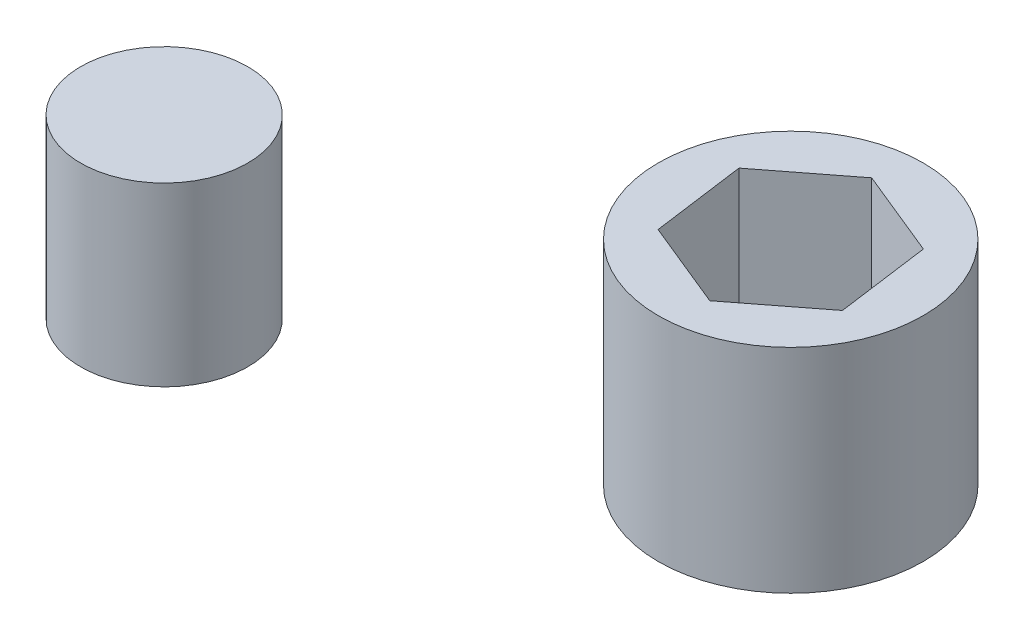
ISO-10303-21;
HEADER;
FILE_DESCRIPTION(('STEP AP214'),'2;1');
FILE_NAME('part.step','',(''),(''),'','','');
FILE_SCHEMA(('AUTOMOTIVE_DESIGN { 1 0 10303 214 1 1 1 1 }'));
ENDSEC;
DATA;
#1=APPLICATION_CONTEXT('core data for automotive mechanical design processes');
#2=APPLICATION_PROTOCOL_DEFINITION('international standard','automotive_design',2000,#1);
#3=PRODUCT_CONTEXT('',#1,'mechanical');
#4=PRODUCT('Part','Part','',(#3));
#5=PRODUCT_RELATED_PRODUCT_CATEGORY('part','',(#4));
#6=PRODUCT_DEFINITION_FORMATION('','',#4);
#7=PRODUCT_DEFINITION_CONTEXT('part definition',#1,'design');
#8=PRODUCT_DEFINITION('design','',#6,#7);
#9=PRODUCT_DEFINITION_SHAPE('','',#8);
#10=(LENGTH_UNIT() NAMED_UNIT(*) SI_UNIT(.MILLI.,.METRE.));
#11=(NAMED_UNIT(*) PLANE_ANGLE_UNIT() SI_UNIT($,.RADIAN.));
#12=(NAMED_UNIT(*) SI_UNIT($,.STERADIAN.) SOLID_ANGLE_UNIT());
#13=UNCERTAINTY_MEASURE_WITH_UNIT(LENGTH_MEASURE(1.E-05),#10,'distance_accuracy_value','');
#14=(GEOMETRIC_REPRESENTATION_CONTEXT(3) GLOBAL_UNCERTAINTY_ASSIGNED_CONTEXT((#13)) GLOBAL_UNIT_ASSIGNED_CONTEXT((#10,
#11,#12)) REPRESENTATION_CONTEXT('',''));
#15=CARTESIAN_POINT('',(0.,0.,0.));
#16=DIRECTION('',(0.,0.,1.));
#17=DIRECTION('',(1.,0.,0.));
#18=AXIS2_PLACEMENT_3D('',#15,#16,#17);
#19=CARTESIAN_POINT('',(172.422527698443,80.264,-63.7213689320332));
#20=DIRECTION('',(0.,1.,0.));
#21=DIRECTION('',(0.,0.,1.));
#22=AXIS2_PLACEMENT_3D('',#19,#20,#21);
#23=PLANE('',#22);
#24=CARTESIAN_POINT('',(172.422527698443,80.264,-63.7213689320332));
#25=DIRECTION('',(0.,1.,0.));
#26=DIRECTION('',(0.,0.,1.));
#27=AXIS2_PLACEMENT_3D('',#24,#25,#26);
#28=CIRCLE('',#27,49.907526651771);
#29=CARTESIAN_POINT('',(172.422527698443,80.264,-13.8138422802622));
#30=VERTEX_POINT('',#29);
#31=EDGE_CURVE('E12',#30,#30,#28,.T.);
#32=ORIENTED_EDGE('',*,*,#31,.T.);
#33=EDGE_LOOP('',(#32));
#34=FACE_BOUND('',#33,.T.);
#35=DIRECTION('',(-0.134867815001697,0.,-0.99086359932973));
#36=VECTOR('',#35,1.);
#37=CARTESIAN_POINT('',(205.40770691032,80.264,-50.2274319817206));
#38=LINE('',#37,#36);
#39=CARTESIAN_POINT('',(205.40770691032,80.264,-50.2274319817206));
#40=VERTEX_POINT('',#39);
#41=CARTESIAN_POINT('',(200.601209500418,80.264,-85.5404036027441));
#42=VERTEX_POINT('',#41);
#43=EDGE_CURVE('E107',#40,#42,#38,.T.);
#44=ORIENTED_EDGE('',*,*,#43,.F.);
#45=DIRECTION('',(0.790679141203983,0.,-0.612230753609235));
#46=VECTOR('',#45,1.);
#47=CARTESIAN_POINT('',(177.229025108345,80.264,-28.4083973110097));
#48=LINE('',#47,#46);
#49=CARTESIAN_POINT('',(177.229025108345,80.264,-28.4083973110097));
#50=VERTEX_POINT('',#49);
#51=EDGE_CURVE('E99',#50,#40,#48,.T.);
#52=ORIENTED_EDGE('',*,*,#51,.F.);
#53=DIRECTION('',(0.92554695620568,0.,0.378632845720495));
#54=VECTOR('',#53,1.);
#55=CARTESIAN_POINT('',(144.243845896469,80.264,-41.9023342613223));
#56=LINE('',#55,#54);
#57=CARTESIAN_POINT('',(144.243845896469,80.264,-41.9023342613223));
#58=VERTEX_POINT('',#57);
#59=EDGE_CURVE('E127',#58,#50,#56,.T.);
#60=ORIENTED_EDGE('',*,*,#59,.F.);
#61=DIRECTION('',(0.134867815001697,0.,0.99086359932973));
#62=VECTOR('',#61,1.);
#63=CARTESIAN_POINT('',(139.437348486567,80.264,-77.2153058823459));
#64=LINE('',#63,#62);
#65=CARTESIAN_POINT('',(139.437348486567,80.264,-77.2153058823459));
#66=VERTEX_POINT('',#65);
#67=EDGE_CURVE('E125',#66,#58,#64,.T.);
#68=ORIENTED_EDGE('',*,*,#67,.F.);
#69=DIRECTION('',(-0.790679141203983,0.,0.612230753609235));
#70=VECTOR('',#69,1.);
#71=CARTESIAN_POINT('',(167.616030288542,80.264,-99.0343405530567));
#72=LINE('',#71,#70);
#73=CARTESIAN_POINT('',(167.616030288542,80.264,-99.0343405530567));
#74=VERTEX_POINT('',#73);
#75=EDGE_CURVE('E121',#74,#66,#72,.T.);
#76=ORIENTED_EDGE('',*,*,#75,.F.);
#77=DIRECTION('',(-0.92554695620568,0.,-0.378632845720495));
#78=VECTOR('',#77,1.);
#79=CARTESIAN_POINT('',(200.601209500418,80.264,-85.5404036027441));
#80=LINE('',#79,#78);
#81=EDGE_CURVE('E119',#42,#74,#80,.T.);
#82=ORIENTED_EDGE('',*,*,#81,.F.);
#83=EDGE_LOOP('',(#44,#52,#60,#68,#76,#82));
#84=FACE_BOUND('',#83,.T.);
#85=ADVANCED_FACE('F46',(#34,#84),#23,.T.);
#86=CARTESIAN_POINT('',(172.422527698443,0.,-63.7213689320332));
#87=DIRECTION('',(0.,1.,0.));
#88=DIRECTION('',(0.,0.,1.));
#89=AXIS2_PLACEMENT_3D('',#86,#87,#88);
#90=PLANE('',#89);
#91=CARTESIAN_POINT('',(172.422527698443,0.,-63.7213689320332));
#92=DIRECTION('',(0.,1.,0.));
#93=DIRECTION('',(0.,0.,1.));
#94=AXIS2_PLACEMENT_3D('',#91,#92,#93);
#95=CIRCLE('',#94,49.907526651771);
#96=CARTESIAN_POINT('',(172.422527698443,0.,-13.8138422802622));
#97=VERTEX_POINT('',#96);
#98=EDGE_CURVE('E50',#97,#97,#95,.T.);
#99=ORIENTED_EDGE('',*,*,#98,.F.);
#100=EDGE_LOOP('',(#99));
#101=FACE_BOUND('',#100,.T.);
#102=DIRECTION('',(0.790679141203983,0.,-0.612230753609235));
#103=VECTOR('',#102,1.);
#104=CARTESIAN_POINT('',(177.229025108345,0.,-28.4083973110097));
#105=LINE('',#104,#103);
#106=CARTESIAN_POINT('',(177.229025108345,0.,-28.4083973110097));
#107=VERTEX_POINT('',#106);
#108=CARTESIAN_POINT('',(205.40770691032,0.,-50.2274319817206));
#109=VERTEX_POINT('',#108);
#110=EDGE_CURVE('E69',#107,#109,#105,.T.);
#111=ORIENTED_EDGE('',*,*,#110,.T.);
#112=DIRECTION('',(-0.134867815001697,0.,-0.99086359932973));
#113=VECTOR('',#112,1.);
#114=CARTESIAN_POINT('',(205.40770691032,0.,-50.2274319817206));
#115=LINE('',#114,#113);
#116=CARTESIAN_POINT('',(200.601209500418,0.,-85.5404036027441));
#117=VERTEX_POINT('',#116);
#118=EDGE_CURVE('E114',#109,#117,#115,.T.);
#119=ORIENTED_EDGE('',*,*,#118,.T.);
#120=DIRECTION('',(-0.92554695620568,0.,-0.378632845720495));
#121=VECTOR('',#120,1.);
#122=CARTESIAN_POINT('',(200.601209500418,0.,-85.5404036027441));
#123=LINE('',#122,#121);
#124=CARTESIAN_POINT('',(167.616030288542,0.,-99.0343405530567));
#125=VERTEX_POINT('',#124);
#126=EDGE_CURVE('E131',#117,#125,#123,.T.);
#127=ORIENTED_EDGE('',*,*,#126,.T.);
#128=DIRECTION('',(-0.790679141203983,0.,0.612230753609235));
#129=VECTOR('',#128,1.);
#130=CARTESIAN_POINT('',(167.616030288542,0.,-99.0343405530567));
#131=LINE('',#130,#129);
#132=CARTESIAN_POINT('',(139.437348486567,0.,-77.2153058823459));
#133=VERTEX_POINT('',#132);
#134=EDGE_CURVE('E134',#125,#133,#131,.T.);
#135=ORIENTED_EDGE('',*,*,#134,.T.);
#136=DIRECTION('',(0.134867815001697,0.,0.99086359932973));
#137=VECTOR('',#136,1.);
#138=CARTESIAN_POINT('',(139.437348486567,0.,-77.2153058823459));
#139=LINE('',#138,#137);
#140=CARTESIAN_POINT('',(144.243845896469,0.,-41.9023342613223));
#141=VERTEX_POINT('',#140);
#142=EDGE_CURVE('E137',#133,#141,#139,.T.);
#143=ORIENTED_EDGE('',*,*,#142,.T.);
#144=DIRECTION('',(0.92554695620568,0.,0.378632845720495));
#145=VECTOR('',#144,1.);
#146=CARTESIAN_POINT('',(144.243845896469,0.,-41.9023342613223));
#147=LINE('',#146,#145);
#148=EDGE_CURVE('E108',#141,#107,#147,.T.);
#149=ORIENTED_EDGE('',*,*,#148,.T.);
#150=EDGE_LOOP('',(#111,#119,#127,#135,#143,#149));
#151=FACE_BOUND('',#150,.T.);
#152=ADVANCED_FACE('F154',(#101,#151),#90,.F.);
#153=CARTESIAN_POINT('',(172.422527698443,80.264,-63.7213689320332));
#154=DIRECTION('',(0.,-1.,0.));
#155=DIRECTION('',(0.,0.,-1.));
#156=AXIS2_PLACEMENT_3D('',#153,#154,#155);
#157=CYLINDRICAL_SURFACE('',#156,49.907526651771);
#158=ORIENTED_EDGE('',*,*,#31,.F.);
#159=EDGE_LOOP('',(#158));
#160=FACE_BOUND('',#159,.T.);
#161=ORIENTED_EDGE('',*,*,#98,.T.);
#162=EDGE_LOOP('',(#161));
#163=FACE_BOUND('',#162,.T.);
#164=ADVANCED_FACE('F48',(#160,#163),#157,.T.);
#165=CARTESIAN_POINT('',(177.229025108345,80.264,-28.4083973110097));
#166=DIRECTION('',(-0.612230753609235,0.,-0.790679141203983));
#167=DIRECTION('',(-0.790679141203983,0.,0.612230753609235));
#168=AXIS2_PLACEMENT_3D('',#165,#166,#167);
#169=PLANE('',#168);
#170=ORIENTED_EDGE('',*,*,#110,.F.);
#171=DIRECTION('',(0.,-1.,0.));
#172=VECTOR('',#171,1.);
#173=CARTESIAN_POINT('',(177.229025108345,80.264,-28.4083973110097));
#174=LINE('',#173,#172);
#175=EDGE_CURVE('E103',#50,#107,#174,.T.);
#176=ORIENTED_EDGE('',*,*,#175,.F.);
#177=ORIENTED_EDGE('',*,*,#51,.T.);
#178=DIRECTION('',(0.,-1.,0.));
#179=VECTOR('',#178,1.);
#180=CARTESIAN_POINT('',(205.40770691032,80.264,-50.2274319817206));
#181=LINE('',#180,#179);
#182=EDGE_CURVE('E102',#40,#109,#181,.T.);
#183=ORIENTED_EDGE('',*,*,#182,.T.);
#184=EDGE_LOOP('',(#170,#176,#177,#183));
#185=FACE_BOUND('',#184,.T.);
#186=ADVANCED_FACE('F101',(#185),#169,.T.);
#187=CARTESIAN_POINT('',(205.40770691032,80.264,-50.2274319817206));
#188=DIRECTION('',(-0.99086359932973,0.,0.134867815001697));
#189=DIRECTION('',(0.134867815001697,0.,0.99086359932973));
#190=AXIS2_PLACEMENT_3D('',#187,#188,#189);
#191=PLANE('',#190);
#192=ORIENTED_EDGE('',*,*,#118,.F.);
#193=ORIENTED_EDGE('',*,*,#182,.F.);
#194=ORIENTED_EDGE('',*,*,#43,.T.);
#195=DIRECTION('',(0.,-1.,0.));
#196=VECTOR('',#195,1.);
#197=CARTESIAN_POINT('',(200.601209500418,80.264,-85.5404036027441));
#198=LINE('',#197,#196);
#199=EDGE_CURVE('E115',#42,#117,#198,.T.);
#200=ORIENTED_EDGE('',*,*,#199,.T.);
#201=EDGE_LOOP('',(#192,#193,#194,#200));
#202=FACE_BOUND('',#201,.T.);
#203=ADVANCED_FACE('F111',(#202),#191,.T.);
#204=CARTESIAN_POINT('',(200.601209500418,80.264,-85.5404036027441));
#205=DIRECTION('',(-0.378632845720495,0.,0.92554695620568));
#206=DIRECTION('',(0.92554695620568,0.,0.378632845720495));
#207=AXIS2_PLACEMENT_3D('',#204,#205,#206);
#208=PLANE('',#207);
#209=ORIENTED_EDGE('',*,*,#126,.F.);
#210=ORIENTED_EDGE('',*,*,#199,.F.);
#211=ORIENTED_EDGE('',*,*,#81,.T.);
#212=DIRECTION('',(0.,-1.,0.));
#213=VECTOR('',#212,1.);
#214=CARTESIAN_POINT('',(167.616030288542,80.264,-99.0343405530567));
#215=LINE('',#214,#213);
#216=EDGE_CURVE('E146',#74,#125,#215,.T.);
#217=ORIENTED_EDGE('',*,*,#216,.T.);
#218=EDGE_LOOP('',(#209,#210,#211,#217));
#219=FACE_BOUND('',#218,.T.);
#220=ADVANCED_FACE('F150',(#219),#208,.T.);
#221=CARTESIAN_POINT('',(167.616030288542,80.264,-99.0343405530567));
#222=DIRECTION('',(0.612230753609235,0.,0.790679141203983));
#223=DIRECTION('',(0.790679141203983,0.,-0.612230753609235));
#224=AXIS2_PLACEMENT_3D('',#221,#222,#223);
#225=PLANE('',#224);
#226=ORIENTED_EDGE('',*,*,#134,.F.);
#227=ORIENTED_EDGE('',*,*,#216,.F.);
#228=ORIENTED_EDGE('',*,*,#75,.T.);
#229=DIRECTION('',(0.,-1.,0.));
#230=VECTOR('',#229,1.);
#231=CARTESIAN_POINT('',(139.437348486567,80.264,-77.2153058823459));
#232=LINE('',#231,#230);
#233=EDGE_CURVE('E144',#66,#133,#232,.T.);
#234=ORIENTED_EDGE('',*,*,#233,.T.);
#235=EDGE_LOOP('',(#226,#227,#228,#234));
#236=FACE_BOUND('',#235,.T.);
#237=ADVANCED_FACE('F162',(#236),#225,.T.);
#238=CARTESIAN_POINT('',(139.437348486567,80.264,-77.2153058823459));
#239=DIRECTION('',(0.99086359932973,0.,-0.134867815001697));
#240=DIRECTION('',(-0.134867815001697,0.,-0.99086359932973));
#241=AXIS2_PLACEMENT_3D('',#238,#239,#240);
#242=PLANE('',#241);
#243=ORIENTED_EDGE('',*,*,#142,.F.);
#244=ORIENTED_EDGE('',*,*,#233,.F.);
#245=ORIENTED_EDGE('',*,*,#67,.T.);
#246=DIRECTION('',(0.,-1.,0.));
#247=VECTOR('',#246,1.);
#248=CARTESIAN_POINT('',(144.243845896469,80.264,-41.9023342613223));
#249=LINE('',#248,#247);
#250=EDGE_CURVE('E61',#58,#141,#249,.T.);
#251=ORIENTED_EDGE('',*,*,#250,.T.);
#252=EDGE_LOOP('',(#243,#244,#245,#251));
#253=FACE_BOUND('',#252,.T.);
#254=ADVANCED_FACE('F160',(#253),#242,.T.);
#255=CARTESIAN_POINT('',(144.243845896469,80.264,-41.9023342613223));
#256=DIRECTION('',(0.378632845720495,0.,-0.92554695620568));
#257=DIRECTION('',(-0.92554695620568,0.,-0.378632845720495));
#258=AXIS2_PLACEMENT_3D('',#255,#256,#257);
#259=PLANE('',#258);
#260=ORIENTED_EDGE('',*,*,#148,.F.);
#261=ORIENTED_EDGE('',*,*,#250,.F.);
#262=ORIENTED_EDGE('',*,*,#59,.T.);
#263=ORIENTED_EDGE('',*,*,#175,.T.);
#264=EDGE_LOOP('',(#260,#261,#262,#263));
#265=FACE_BOUND('',#264,.T.);
#266=ADVANCED_FACE('F156',(#265),#259,.T.);
#267=CLOSED_SHELL('',(#85,#152,#164,#186,#203,#220,#237,#254,#266));
#268=MANIFOLD_SOLID_BREP('B2',#267);
#269=CARTESIAN_POINT('',(0.,66.521017017017,0.));
#270=DIRECTION('',(0.,1.,0.));
#271=DIRECTION('',(0.,0.,1.));
#272=AXIS2_PLACEMENT_3D('',#269,#270,#271);
#273=PLANE('',#272);
#274=CARTESIAN_POINT('',(0.,66.521017017017,0.));
#275=DIRECTION('',(0.,-1.,0.));
#276=DIRECTION('',(0.,0.,-1.));
#277=AXIS2_PLACEMENT_3D('',#274,#275,#276);
#278=CIRCLE('',#277,31.4983623623623);
#279=CARTESIAN_POINT('',(0.,66.521017017017,-31.4983623623623));
#280=VERTEX_POINT('',#279);
#281=EDGE_CURVE('E45',#280,#280,#278,.T.);
#282=ORIENTED_EDGE('',*,*,#281,.F.);
#283=EDGE_LOOP('',(#282));
#284=FACE_BOUND('',#283,.T.);
#285=ADVANCED_FACE('F242',(#284),#273,.T.);
#286=CARTESIAN_POINT('',(0.,0.,0.));
#287=DIRECTION('',(0.,-1.,0.));
#288=DIRECTION('',(0.,0.,-1.));
#289=AXIS2_PLACEMENT_3D('',#286,#287,#288);
#290=CYLINDRICAL_SURFACE('',#289,31.4983623623623);
#291=ORIENTED_EDGE('',*,*,#281,.T.);
#292=EDGE_LOOP('',(#291));
#293=FACE_BOUND('',#292,.T.);
#294=CARTESIAN_POINT('',(0.,0.,0.));
#295=DIRECTION('',(0.,-1.,0.));
#296=DIRECTION('',(0.,0.,-1.));
#297=AXIS2_PLACEMENT_3D('',#294,#295,#296);
#298=CIRCLE('',#297,31.4983623623623);
#299=CARTESIAN_POINT('',(0.,0.,-31.4983623623623));
#300=VERTEX_POINT('',#299);
#301=EDGE_CURVE('E248',#300,#300,#298,.T.);
#302=ORIENTED_EDGE('',*,*,#301,.F.);
#303=EDGE_LOOP('',(#302));
#304=FACE_BOUND('',#303,.T.);
#305=ADVANCED_FACE('F256',(#293,#304),#290,.T.);
#306=CARTESIAN_POINT('',(0.,0.,0.));
#307=DIRECTION('',(0.,-1.,0.));
#308=DIRECTION('',(0.,0.,-1.));
#309=AXIS2_PLACEMENT_3D('',#306,#307,#308);
#310=PLANE('',#309);
#311=ORIENTED_EDGE('',*,*,#301,.T.);
#312=EDGE_LOOP('',(#311));
#313=FACE_BOUND('',#312,.T.);
#314=ADVANCED_FACE('F254',(#313),#310,.T.);
#315=CLOSED_SHELL('',(#285,#305,#314));
#316=MANIFOLD_SOLID_BREP('B6',#315);
#317=ADVANCED_BREP_SHAPE_REPRESENTATION('',(#18,#268,#316),#14);
#318=SHAPE_DEFINITION_REPRESENTATION(#9,#317);
ENDSEC;
END-ISO-10303-21;
